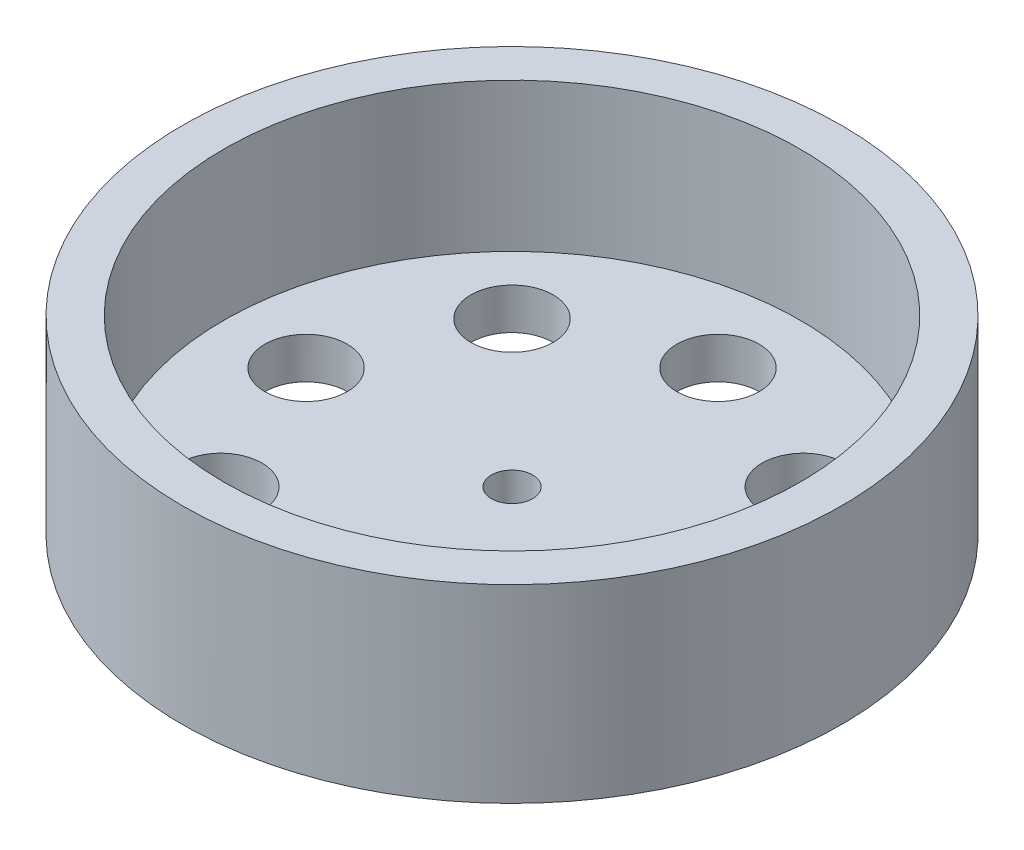
ISO-10303-21;
HEADER;
FILE_DESCRIPTION(('STEP AP214'),'2;1');
FILE_NAME('part.step','',(''),(''),'','','');
FILE_SCHEMA(('AUTOMOTIVE_DESIGN { 1 0 10303 214 1 1 1 1 }'));
ENDSEC;
DATA;
#1=APPLICATION_CONTEXT('core data for automotive mechanical design processes');
#2=APPLICATION_PROTOCOL_DEFINITION('international standard','automotive_design',2000,#1);
#3=PRODUCT_CONTEXT('',#1,'mechanical');
#4=PRODUCT('Part','Part','',(#3));
#5=PRODUCT_RELATED_PRODUCT_CATEGORY('part','',(#4));
#6=PRODUCT_DEFINITION_FORMATION('','',#4);
#7=PRODUCT_DEFINITION_CONTEXT('part definition',#1,'design');
#8=PRODUCT_DEFINITION('design','',#6,#7);
#9=PRODUCT_DEFINITION_SHAPE('','',#8);
#10=(LENGTH_UNIT() NAMED_UNIT(*) SI_UNIT(.MILLI.,.METRE.));
#11=(NAMED_UNIT(*) PLANE_ANGLE_UNIT() SI_UNIT($,.RADIAN.));
#12=(NAMED_UNIT(*) SI_UNIT($,.STERADIAN.) SOLID_ANGLE_UNIT());
#13=UNCERTAINTY_MEASURE_WITH_UNIT(LENGTH_MEASURE(1.E-05),#10,'distance_accuracy_value','');
#14=(GEOMETRIC_REPRESENTATION_CONTEXT(3) GLOBAL_UNCERTAINTY_ASSIGNED_CONTEXT((#13)) GLOBAL_UNIT_ASSIGNED_CONTEXT((#10,
#11,#12)) REPRESENTATION_CONTEXT('',''));
#15=CARTESIAN_POINT('',(0.,0.,0.));
#16=DIRECTION('',(0.,0.,1.));
#17=DIRECTION('',(1.,0.,0.));
#18=AXIS2_PLACEMENT_3D('',#15,#16,#17);
#19=CARTESIAN_POINT('',(0.,35.,0.));
#20=DIRECTION('',(0.,-1.,0.));
#21=DIRECTION('',(0.,0.,-1.));
#22=AXIS2_PLACEMENT_3D('',#19,#20,#21);
#23=CYLINDRICAL_SURFACE('',#22,40.);
#24=CARTESIAN_POINT('',(0.,35.,0.));
#25=DIRECTION('',(0.,1.,0.));
#26=DIRECTION('',(0.,0.,1.));
#27=AXIS2_PLACEMENT_3D('',#24,#25,#26);
#28=CIRCLE('',#27,40.);
#29=CARTESIAN_POINT('',(0.,35.,40.));
#30=VERTEX_POINT('',#29);
#31=EDGE_CURVE('E10',#30,#30,#28,.T.);
#32=ORIENTED_EDGE('',*,*,#31,.F.);
#33=EDGE_LOOP('',(#32));
#34=FACE_BOUND('',#33,.T.);
#35=CARTESIAN_POINT('',(0.,12.,0.));
#36=DIRECTION('',(0.,-1.,0.));
#37=DIRECTION('',(0.,0.,-1.));
#38=AXIS2_PLACEMENT_3D('',#35,#36,#37);
#39=CIRCLE('',#38,40.);
#40=CARTESIAN_POINT('',(0.,12.,-40.));
#41=VERTEX_POINT('',#40);
#42=EDGE_CURVE('E50',#41,#41,#39,.T.);
#43=ORIENTED_EDGE('',*,*,#42,.F.);
#44=EDGE_LOOP('',(#43));
#45=FACE_BOUND('',#44,.T.);
#46=ADVANCED_FACE('F31',(#34,#45),#23,.T.);
#47=CARTESIAN_POINT('',(0.,5.,0.));
#48=DIRECTION('',(0.,1.,0.));
#49=DIRECTION('',(0.,0.,1.));
#50=AXIS2_PLACEMENT_3D('',#47,#48,#49);
#51=CYLINDRICAL_SURFACE('',#50,2.5);
#52=CARTESIAN_POINT('',(0.,17.,0.));
#53=DIRECTION('',(0.,1.,0.));
#54=DIRECTION('',(0.,0.,1.));
#55=AXIS2_PLACEMENT_3D('',#52,#53,#54);
#56=CIRCLE('',#55,2.5);
#57=CARTESIAN_POINT('',(0.,17.,2.5));
#58=VERTEX_POINT('',#57);
#59=EDGE_CURVE('E46',#58,#58,#56,.T.);
#60=ORIENTED_EDGE('',*,*,#59,.T.);
#61=EDGE_LOOP('',(#60));
#62=FACE_BOUND('',#61,.T.);
#63=CARTESIAN_POINT('',(0.,12.,0.));
#64=DIRECTION('',(0.,-1.,0.));
#65=DIRECTION('',(0.,0.,-1.));
#66=AXIS2_PLACEMENT_3D('',#63,#64,#65);
#67=CIRCLE('',#66,2.5);
#68=CARTESIAN_POINT('',(0.,12.,-2.5));
#69=VERTEX_POINT('',#68);
#70=EDGE_CURVE('E34',#69,#69,#67,.F.);
#71=ORIENTED_EDGE('',*,*,#70,.F.);
#72=EDGE_LOOP('',(#71));
#73=FACE_BOUND('',#72,.T.);
#74=ADVANCED_FACE('F118',(#62,#73),#51,.F.);
#75=CARTESIAN_POINT('',(0.,35.,0.));
#76=DIRECTION('',(0.,1.,0.));
#77=DIRECTION('',(0.,0.,1.));
#78=AXIS2_PLACEMENT_3D('',#75,#76,#77);
#79=PLANE('',#78);
#80=CARTESIAN_POINT('',(0.,35.,0.));
#81=DIRECTION('',(0.,1.,0.));
#82=DIRECTION('',(0.,0.,1.));
#83=AXIS2_PLACEMENT_3D('',#80,#81,#82);
#84=CIRCLE('',#83,35.);
#85=CARTESIAN_POINT('',(0.,35.,35.));
#86=VERTEX_POINT('',#85);
#87=EDGE_CURVE('E42',#86,#86,#84,.T.);
#88=ORIENTED_EDGE('',*,*,#87,.F.);
#89=EDGE_LOOP('',(#88));
#90=FACE_BOUND('',#89,.T.);
#91=ORIENTED_EDGE('',*,*,#31,.T.);
#92=EDGE_LOOP('',(#91));
#93=FACE_BOUND('',#92,.T.);
#94=ADVANCED_FACE('F120',(#90,#93),#79,.T.);
#95=CARTESIAN_POINT('',(0.,17.,0.));
#96=DIRECTION('',(0.,1.,0.));
#97=DIRECTION('',(0.,0.,1.));
#98=AXIS2_PLACEMENT_3D('',#95,#96,#97);
#99=CYLINDRICAL_SURFACE('',#98,35.);
#100=CARTESIAN_POINT('',(0.,17.,0.));
#101=DIRECTION('',(0.,1.,0.));
#102=DIRECTION('',(0.,0.,1.));
#103=AXIS2_PLACEMENT_3D('',#100,#101,#102);
#104=CIRCLE('',#103,35.);
#105=CARTESIAN_POINT('',(0.,17.,35.));
#106=VERTEX_POINT('',#105);
#107=EDGE_CURVE('E38',#106,#106,#104,.T.);
#108=ORIENTED_EDGE('',*,*,#107,.F.);
#109=EDGE_LOOP('',(#108));
#110=FACE_BOUND('',#109,.T.);
#111=ORIENTED_EDGE('',*,*,#87,.T.);
#112=EDGE_LOOP('',(#111));
#113=FACE_BOUND('',#112,.T.);
#114=ADVANCED_FACE('F127',(#110,#113),#99,.F.);
#115=CARTESIAN_POINT('',(0.,17.,0.));
#116=DIRECTION('',(0.,1.,0.));
#117=DIRECTION('',(0.,0.,1.));
#118=AXIS2_PLACEMENT_3D('',#115,#116,#117);
#119=PLANE('',#118);
#120=CARTESIAN_POINT('',(-17.6776695296639,17.,-17.6776695296635));
#121=DIRECTION('',(0.,1.,0.));
#122=DIRECTION('',(0.,0.,1.));
#123=AXIS2_PLACEMENT_3D('',#120,#121,#122);
#124=CIRCLE('',#123,5.);
#125=CARTESIAN_POINT('',(-17.6776695296639,17.,-12.6776695296635));
#126=VERTEX_POINT('',#125);
#127=EDGE_CURVE('E53',#126,#126,#124,.T.);
#128=ORIENTED_EDGE('',*,*,#127,.F.);
#129=EDGE_LOOP('',(#128));
#130=FACE_BOUND('',#129,.T.);
#131=CARTESIAN_POINT('',(-2.61861100413235E-13,17.,-25.));
#132=DIRECTION('',(0.,1.,0.));
#133=DIRECTION('',(0.,0.,1.));
#134=AXIS2_PLACEMENT_3D('',#131,#132,#133);
#135=CIRCLE('',#134,5.);
#136=CARTESIAN_POINT('',(-2.61861100413235E-13,17.,-20.));
#137=VERTEX_POINT('',#136);
#138=EDGE_CURVE('E56',#137,#137,#135,.T.);
#139=ORIENTED_EDGE('',*,*,#138,.F.);
#140=EDGE_LOOP('',(#139));
#141=FACE_BOUND('',#140,.T.);
#142=CARTESIAN_POINT('',(17.6776695296635,17.,-17.6776695296638));
#143=DIRECTION('',(0.,1.,0.));
#144=DIRECTION('',(0.,0.,1.));
#145=AXIS2_PLACEMENT_3D('',#142,#143,#144);
#146=CIRCLE('',#145,5.);
#147=CARTESIAN_POINT('',(17.6776695296635,17.,-12.6776695296638));
#148=VERTEX_POINT('',#147);
#149=EDGE_CURVE('E59',#148,#148,#146,.T.);
#150=ORIENTED_EDGE('',*,*,#149,.F.);
#151=EDGE_LOOP('',(#150));
#152=FACE_BOUND('',#151,.T.);
#153=CARTESIAN_POINT('',(25.,17.,-1.74574066942157E-13));
#154=DIRECTION('',(0.,1.,0.));
#155=DIRECTION('',(0.,0.,1.));
#156=AXIS2_PLACEMENT_3D('',#153,#154,#155);
#157=CIRCLE('',#156,5.);
#158=CARTESIAN_POINT('',(25.,17.,4.99999999999983));
#159=VERTEX_POINT('',#158);
#160=EDGE_CURVE('E62',#159,#159,#157,.T.);
#161=ORIENTED_EDGE('',*,*,#160,.F.);
#162=EDGE_LOOP('',(#161));
#163=FACE_BOUND('',#162,.T.);
#164=CARTESIAN_POINT('',(17.6776695296638,17.,17.6776695296636));
#165=DIRECTION('',(0.,1.,0.));
#166=DIRECTION('',(0.,0.,1.));
#167=AXIS2_PLACEMENT_3D('',#164,#165,#166);
#168=CIRCLE('',#167,5.);
#169=CARTESIAN_POINT('',(17.6776695296638,17.,22.6776695296636));
#170=VERTEX_POINT('',#169);
#171=EDGE_CURVE('E65',#170,#170,#168,.T.);
#172=ORIENTED_EDGE('',*,*,#171,.F.);
#173=EDGE_LOOP('',(#172));
#174=FACE_BOUND('',#173,.T.);
#175=CARTESIAN_POINT('',(0.,17.,25.));
#176=DIRECTION('',(0.,1.,0.));
#177=DIRECTION('',(0.,0.,1.));
#178=AXIS2_PLACEMENT_3D('',#175,#176,#177);
#179=CIRCLE('',#178,5.);
#180=CARTESIAN_POINT('',(0.,17.,30.));
#181=VERTEX_POINT('',#180);
#182=EDGE_CURVE('E68',#181,#181,#179,.T.);
#183=ORIENTED_EDGE('',*,*,#182,.F.);
#184=EDGE_LOOP('',(#183));
#185=FACE_BOUND('',#184,.T.);
#186=CARTESIAN_POINT('',(-17.6776695296637,17.,17.6776695296637));
#187=DIRECTION('',(0.,1.,0.));
#188=DIRECTION('',(0.,0.,1.));
#189=AXIS2_PLACEMENT_3D('',#186,#187,#188);
#190=CIRCLE('',#189,5.);
#191=CARTESIAN_POINT('',(-17.6776695296637,17.,22.6776695296637));
#192=VERTEX_POINT('',#191);
#193=EDGE_CURVE('E71',#192,#192,#190,.T.);
#194=ORIENTED_EDGE('',*,*,#193,.F.);
#195=EDGE_LOOP('',(#194));
#196=FACE_BOUND('',#195,.T.);
#197=CARTESIAN_POINT('',(-25.,17.,0.));
#198=DIRECTION('',(0.,1.,0.));
#199=DIRECTION('',(0.,0.,1.));
#200=AXIS2_PLACEMENT_3D('',#197,#198,#199);
#201=CIRCLE('',#200,5.);
#202=CARTESIAN_POINT('',(-25.,17.,5.));
#203=VERTEX_POINT('',#202);
#204=EDGE_CURVE('E74',#203,#203,#201,.T.);
#205=ORIENTED_EDGE('',*,*,#204,.F.);
#206=EDGE_LOOP('',(#205));
#207=FACE_BOUND('',#206,.T.);
#208=ORIENTED_EDGE('',*,*,#59,.F.);
#209=EDGE_LOOP('',(#208));
#210=FACE_BOUND('',#209,.T.);
#211=ORIENTED_EDGE('',*,*,#107,.T.);
#212=EDGE_LOOP('',(#211));
#213=FACE_BOUND('',#212,.T.);
#214=ADVANCED_FACE('F108',(#130,#141,#152,#163,#174,#185,#196,#207,#210,#213),#119,.T.);
#215=CARTESIAN_POINT('',(0.,12.,0.));
#216=DIRECTION('',(0.,-1.,0.));
#217=DIRECTION('',(0.,0.,-1.));
#218=AXIS2_PLACEMENT_3D('',#215,#216,#217);
#219=PLANE('',#218);
#220=CARTESIAN_POINT('',(-17.6776695296639,12.,-17.6776695296635));
#221=DIRECTION('',(0.,-1.,0.));
#222=DIRECTION('',(0.,0.,-1.));
#223=AXIS2_PLACEMENT_3D('',#220,#221,#222);
#224=CIRCLE('',#223,5.);
#225=CARTESIAN_POINT('',(-17.6776695296639,12.,-22.6776695296635));
#226=VERTEX_POINT('',#225);
#227=EDGE_CURVE('E81',#226,#226,#224,.T.);
#228=ORIENTED_EDGE('',*,*,#227,.F.);
#229=EDGE_LOOP('',(#228));
#230=FACE_BOUND('',#229,.T.);
#231=CARTESIAN_POINT('',(-2.61861100413235E-13,12.,-25.));
#232=DIRECTION('',(0.,-1.,0.));
#233=DIRECTION('',(0.,0.,-1.));
#234=AXIS2_PLACEMENT_3D('',#231,#232,#233);
#235=CIRCLE('',#234,5.);
#236=CARTESIAN_POINT('',(-2.61861100413235E-13,12.,-30.));
#237=VERTEX_POINT('',#236);
#238=EDGE_CURVE('E84',#237,#237,#235,.T.);
#239=ORIENTED_EDGE('',*,*,#238,.F.);
#240=EDGE_LOOP('',(#239));
#241=FACE_BOUND('',#240,.T.);
#242=CARTESIAN_POINT('',(17.6776695296635,12.,-17.6776695296638));
#243=DIRECTION('',(0.,-1.,0.));
#244=DIRECTION('',(0.,0.,-1.));
#245=AXIS2_PLACEMENT_3D('',#242,#243,#244);
#246=CIRCLE('',#245,5.);
#247=CARTESIAN_POINT('',(17.6776695296635,12.,-22.6776695296638));
#248=VERTEX_POINT('',#247);
#249=EDGE_CURVE('E87',#248,#248,#246,.T.);
#250=ORIENTED_EDGE('',*,*,#249,.F.);
#251=EDGE_LOOP('',(#250));
#252=FACE_BOUND('',#251,.T.);
#253=CARTESIAN_POINT('',(25.,12.,-1.74574066942157E-13));
#254=DIRECTION('',(0.,-1.,0.));
#255=DIRECTION('',(0.,0.,-1.));
#256=AXIS2_PLACEMENT_3D('',#253,#254,#255);
#257=CIRCLE('',#256,5.);
#258=CARTESIAN_POINT('',(25.,12.,-5.00000000000017));
#259=VERTEX_POINT('',#258);
#260=EDGE_CURVE('E90',#259,#259,#257,.T.);
#261=ORIENTED_EDGE('',*,*,#260,.F.);
#262=EDGE_LOOP('',(#261));
#263=FACE_BOUND('',#262,.T.);
#264=CARTESIAN_POINT('',(17.6776695296638,12.,17.6776695296636));
#265=DIRECTION('',(0.,-1.,0.));
#266=DIRECTION('',(0.,0.,-1.));
#267=AXIS2_PLACEMENT_3D('',#264,#265,#266);
#268=CIRCLE('',#267,5.);
#269=CARTESIAN_POINT('',(17.6776695296638,12.,12.6776695296636));
#270=VERTEX_POINT('',#269);
#271=EDGE_CURVE('E93',#270,#270,#268,.T.);
#272=ORIENTED_EDGE('',*,*,#271,.F.);
#273=EDGE_LOOP('',(#272));
#274=FACE_BOUND('',#273,.T.);
#275=CARTESIAN_POINT('',(0.,12.,25.));
#276=DIRECTION('',(0.,-1.,0.));
#277=DIRECTION('',(0.,0.,-1.));
#278=AXIS2_PLACEMENT_3D('',#275,#276,#277);
#279=CIRCLE('',#278,5.);
#280=CARTESIAN_POINT('',(0.,12.,20.));
#281=VERTEX_POINT('',#280);
#282=EDGE_CURVE('E96',#281,#281,#279,.T.);
#283=ORIENTED_EDGE('',*,*,#282,.F.);
#284=EDGE_LOOP('',(#283));
#285=FACE_BOUND('',#284,.T.);
#286=CARTESIAN_POINT('',(-17.6776695296637,12.,17.6776695296637));
#287=DIRECTION('',(0.,-1.,0.));
#288=DIRECTION('',(0.,0.,-1.));
#289=AXIS2_PLACEMENT_3D('',#286,#287,#288);
#290=CIRCLE('',#289,5.);
#291=CARTESIAN_POINT('',(-17.6776695296637,12.,12.6776695296637));
#292=VERTEX_POINT('',#291);
#293=EDGE_CURVE('E80',#292,#292,#290,.T.);
#294=ORIENTED_EDGE('',*,*,#293,.F.);
#295=EDGE_LOOP('',(#294));
#296=FACE_BOUND('',#295,.T.);
#297=CARTESIAN_POINT('',(-25.,12.,0.));
#298=DIRECTION('',(0.,-1.,0.));
#299=DIRECTION('',(0.,0.,-1.));
#300=AXIS2_PLACEMENT_3D('',#297,#298,#299);
#301=CIRCLE('',#300,5.);
#302=CARTESIAN_POINT('',(-25.,12.,-5.));
#303=VERTEX_POINT('',#302);
#304=EDGE_CURVE('E77',#303,#303,#301,.T.);
#305=ORIENTED_EDGE('',*,*,#304,.F.);
#306=EDGE_LOOP('',(#305));
#307=FACE_BOUND('',#306,.T.);
#308=ORIENTED_EDGE('',*,*,#42,.T.);
#309=EDGE_LOOP('',(#308));
#310=FACE_BOUND('',#309,.T.);
#311=ORIENTED_EDGE('',*,*,#70,.T.);
#312=EDGE_LOOP('',(#311));
#313=FACE_BOUND('',#312,.T.);
#314=ADVANCED_FACE('F104',(#230,#241,#252,#263,#274,#285,#296,#307,#310,#313),#219,.T.);
#315=CARTESIAN_POINT('',(-25.,22.,0.));
#316=DIRECTION('',(0.,-1.,0.));
#317=DIRECTION('',(0.,0.,-1.));
#318=AXIS2_PLACEMENT_3D('',#315,#316,#317);
#319=CYLINDRICAL_SURFACE('',#318,5.);
#320=ORIENTED_EDGE('',*,*,#204,.T.);
#321=EDGE_LOOP('',(#320));
#322=FACE_BOUND('',#321,.T.);
#323=ORIENTED_EDGE('',*,*,#304,.T.);
#324=EDGE_LOOP('',(#323));
#325=FACE_BOUND('',#324,.T.);
#326=ADVANCED_FACE('F107',(#322,#325),#319,.F.);
#327=CARTESIAN_POINT('',(-17.6776695296637,22.,17.6776695296637));
#328=DIRECTION('',(0.,-1.,0.));
#329=DIRECTION('',(0.,0.,-1.));
#330=AXIS2_PLACEMENT_3D('',#327,#328,#329);
#331=CYLINDRICAL_SURFACE('',#330,5.);
#332=ORIENTED_EDGE('',*,*,#193,.T.);
#333=EDGE_LOOP('',(#332));
#334=FACE_BOUND('',#333,.T.);
#335=ORIENTED_EDGE('',*,*,#293,.T.);
#336=EDGE_LOOP('',(#335));
#337=FACE_BOUND('',#336,.T.);
#338=ADVANCED_FACE('F102',(#334,#337),#331,.F.);
#339=CARTESIAN_POINT('',(0.,22.,25.));
#340=DIRECTION('',(0.,-1.,0.));
#341=DIRECTION('',(0.,0.,-1.));
#342=AXIS2_PLACEMENT_3D('',#339,#340,#341);
#343=CYLINDRICAL_SURFACE('',#342,5.);
#344=ORIENTED_EDGE('',*,*,#182,.T.);
#345=EDGE_LOOP('',(#344));
#346=FACE_BOUND('',#345,.T.);
#347=ORIENTED_EDGE('',*,*,#282,.T.);
#348=EDGE_LOOP('',(#347));
#349=FACE_BOUND('',#348,.T.);
#350=ADVANCED_FACE('F166',(#346,#349),#343,.F.);
#351=CARTESIAN_POINT('',(17.6776695296638,22.,17.6776695296636));
#352=DIRECTION('',(0.,-1.,0.));
#353=DIRECTION('',(0.,0.,-1.));
#354=AXIS2_PLACEMENT_3D('',#351,#352,#353);
#355=CYLINDRICAL_SURFACE('',#354,5.);
#356=ORIENTED_EDGE('',*,*,#171,.T.);
#357=EDGE_LOOP('',(#356));
#358=FACE_BOUND('',#357,.T.);
#359=ORIENTED_EDGE('',*,*,#271,.T.);
#360=EDGE_LOOP('',(#359));
#361=FACE_BOUND('',#360,.T.);
#362=ADVANCED_FACE('F174',(#358,#361),#355,.F.);
#363=CARTESIAN_POINT('',(25.,22.,-1.74574066942157E-13));
#364=DIRECTION('',(0.,-1.,0.));
#365=DIRECTION('',(0.,0.,-1.));
#366=AXIS2_PLACEMENT_3D('',#363,#364,#365);
#367=CYLINDRICAL_SURFACE('',#366,5.);
#368=ORIENTED_EDGE('',*,*,#160,.T.);
#369=EDGE_LOOP('',(#368));
#370=FACE_BOUND('',#369,.T.);
#371=ORIENTED_EDGE('',*,*,#260,.T.);
#372=EDGE_LOOP('',(#371));
#373=FACE_BOUND('',#372,.T.);
#374=ADVANCED_FACE('F182',(#370,#373),#367,.F.);
#375=CARTESIAN_POINT('',(17.6776695296635,22.,-17.6776695296638));
#376=DIRECTION('',(0.,-1.,0.));
#377=DIRECTION('',(0.,0.,-1.));
#378=AXIS2_PLACEMENT_3D('',#375,#376,#377);
#379=CYLINDRICAL_SURFACE('',#378,5.);
#380=ORIENTED_EDGE('',*,*,#149,.T.);
#381=EDGE_LOOP('',(#380));
#382=FACE_BOUND('',#381,.T.);
#383=ORIENTED_EDGE('',*,*,#249,.T.);
#384=EDGE_LOOP('',(#383));
#385=FACE_BOUND('',#384,.T.);
#386=ADVANCED_FACE('F190',(#382,#385),#379,.F.);
#387=CARTESIAN_POINT('',(-2.61861100413235E-13,22.,-25.));
#388=DIRECTION('',(0.,-1.,0.));
#389=DIRECTION('',(0.,0.,-1.));
#390=AXIS2_PLACEMENT_3D('',#387,#388,#389);
#391=CYLINDRICAL_SURFACE('',#390,5.);
#392=ORIENTED_EDGE('',*,*,#138,.T.);
#393=EDGE_LOOP('',(#392));
#394=FACE_BOUND('',#393,.T.);
#395=ORIENTED_EDGE('',*,*,#238,.T.);
#396=EDGE_LOOP('',(#395));
#397=FACE_BOUND('',#396,.T.);
#398=ADVANCED_FACE('F198',(#394,#397),#391,.F.);
#399=CARTESIAN_POINT('',(-17.6776695296639,22.,-17.6776695296635));
#400=DIRECTION('',(0.,-1.,0.));
#401=DIRECTION('',(0.,0.,-1.));
#402=AXIS2_PLACEMENT_3D('',#399,#400,#401);
#403=CYLINDRICAL_SURFACE('',#402,5.);
#404=ORIENTED_EDGE('',*,*,#127,.T.);
#405=EDGE_LOOP('',(#404));
#406=FACE_BOUND('',#405,.T.);
#407=ORIENTED_EDGE('',*,*,#227,.T.);
#408=EDGE_LOOP('',(#407));
#409=FACE_BOUND('',#408,.T.);
#410=ADVANCED_FACE('F206',(#406,#409),#403,.F.);
#411=CLOSED_SHELL('',(#46,#74,#94,#114,#214,#314,#326,#338,#350,#362,#374,#386,#398,#410));
#412=MANIFOLD_SOLID_BREP('B2',#411);
#413=ADVANCED_BREP_SHAPE_REPRESENTATION('',(#18,#412),#14);
#414=SHAPE_DEFINITION_REPRESENTATION(#9,#413);
ENDSEC;
END-ISO-10303-21;
